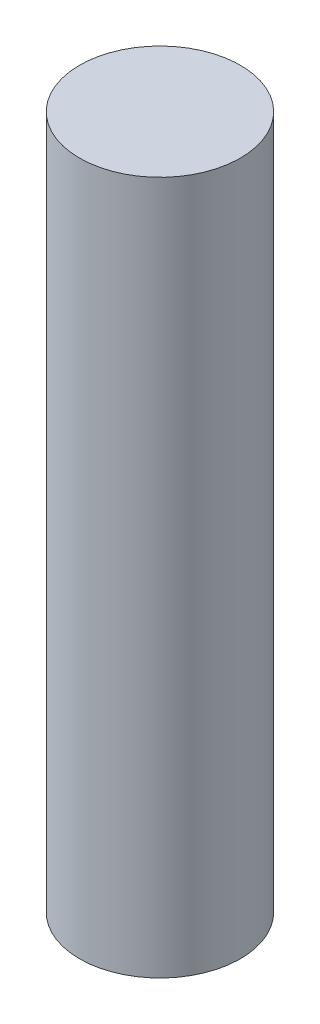
ISO-10303-21;
HEADER;
FILE_DESCRIPTION(('STEP AP214'),'2;1');
FILE_NAME('part.step','',(''),(''),'','','');
FILE_SCHEMA(('AUTOMOTIVE_DESIGN { 1 0 10303 214 1 1 1 1 }'));
ENDSEC;
DATA;
#1=APPLICATION_CONTEXT('core data for automotive mechanical design processes');
#2=APPLICATION_PROTOCOL_DEFINITION('international standard','automotive_design',2000,#1);
#3=PRODUCT_CONTEXT('',#1,'mechanical');
#4=PRODUCT('Part','Part','',(#3));
#5=PRODUCT_RELATED_PRODUCT_CATEGORY('part','',(#4));
#6=PRODUCT_DEFINITION_FORMATION('','',#4);
#7=PRODUCT_DEFINITION_CONTEXT('part definition',#1,'design');
#8=PRODUCT_DEFINITION('design','',#6,#7);
#9=PRODUCT_DEFINITION_SHAPE('','',#8);
#10=(LENGTH_UNIT() NAMED_UNIT(*) SI_UNIT(.MILLI.,.METRE.));
#11=(NAMED_UNIT(*) PLANE_ANGLE_UNIT() SI_UNIT($,.RADIAN.));
#12=(NAMED_UNIT(*) SI_UNIT($,.STERADIAN.) SOLID_ANGLE_UNIT());
#13=UNCERTAINTY_MEASURE_WITH_UNIT(LENGTH_MEASURE(1.E-05),#10,'distance_accuracy_value','');
#14=(GEOMETRIC_REPRESENTATION_CONTEXT(3) GLOBAL_UNCERTAINTY_ASSIGNED_CONTEXT((#13)) GLOBAL_UNIT_ASSIGNED_CONTEXT((#10,
#11,#12)) REPRESENTATION_CONTEXT('',''));
#15=CARTESIAN_POINT('',(0.,0.,0.));
#16=DIRECTION('',(0.,0.,1.));
#17=DIRECTION('',(1.,0.,0.));
#18=AXIS2_PLACEMENT_3D('',#15,#16,#17);
#19=CARTESIAN_POINT('',(0.,43.,0.));
#20=DIRECTION('',(0.,-1.,0.));
#21=DIRECTION('',(0.,0.,-1.));
#22=AXIS2_PLACEMENT_3D('',#19,#20,#21);
#23=CYLINDRICAL_SURFACE('',#22,4.9875);
#24=CARTESIAN_POINT('',(0.,43.,0.));
#25=DIRECTION('',(0.,1.,0.));
#26=DIRECTION('',(0.,0.,1.));
#27=AXIS2_PLACEMENT_3D('',#24,#25,#26);
#28=CIRCLE('',#27,4.9875);
#29=CARTESIAN_POINT('',(0.,43.,4.9875));
#30=VERTEX_POINT('',#29);
#31=EDGE_CURVE('E10',#30,#30,#28,.T.);
#32=ORIENTED_EDGE('',*,*,#31,.F.);
#33=EDGE_LOOP('',(#32));
#34=FACE_BOUND('',#33,.T.);
#35=CARTESIAN_POINT('',(0.,0.,0.));
#36=DIRECTION('',(0.,1.,0.));
#37=DIRECTION('',(0.,0.,1.));
#38=AXIS2_PLACEMENT_3D('',#35,#36,#37);
#39=CIRCLE('',#38,4.9875);
#40=CARTESIAN_POINT('',(0.,0.,4.9875));
#41=VERTEX_POINT('',#40);
#42=EDGE_CURVE('E46',#41,#41,#39,.T.);
#43=ORIENTED_EDGE('',*,*,#42,.T.);
#44=EDGE_LOOP('',(#43));
#45=FACE_BOUND('',#44,.T.);
#46=ADVANCED_FACE('F43',(#34,#45),#23,.T.);
#47=CARTESIAN_POINT('',(0.,43.,0.));
#48=DIRECTION('',(0.,1.,0.));
#49=DIRECTION('',(0.,0.,1.));
#50=AXIS2_PLACEMENT_3D('',#47,#48,#49);
#51=PLANE('',#50);
#52=ORIENTED_EDGE('',*,*,#31,.T.);
#53=EDGE_LOOP('',(#52));
#54=FACE_BOUND('',#53,.T.);
#55=ADVANCED_FACE('F60',(#54),#51,.T.);
#56=CARTESIAN_POINT('',(0.,0.,0.));
#57=DIRECTION('',(0.,1.,0.));
#58=DIRECTION('',(0.,0.,1.));
#59=AXIS2_PLACEMENT_3D('',#56,#57,#58);
#60=PLANE('',#59);
#61=ORIENTED_EDGE('',*,*,#42,.F.);
#62=EDGE_LOOP('',(#61));
#63=FACE_BOUND('',#62,.T.);
#64=ADVANCED_FACE('F58',(#63),#60,.F.);
#65=CLOSED_SHELL('',(#46,#55,#64));
#66=MANIFOLD_SOLID_BREP('B2',#65);
#67=ADVANCED_BREP_SHAPE_REPRESENTATION('',(#18,#66),#14);
#68=SHAPE_DEFINITION_REPRESENTATION(#9,#67);
ENDSEC;
END-ISO-10303-21;
